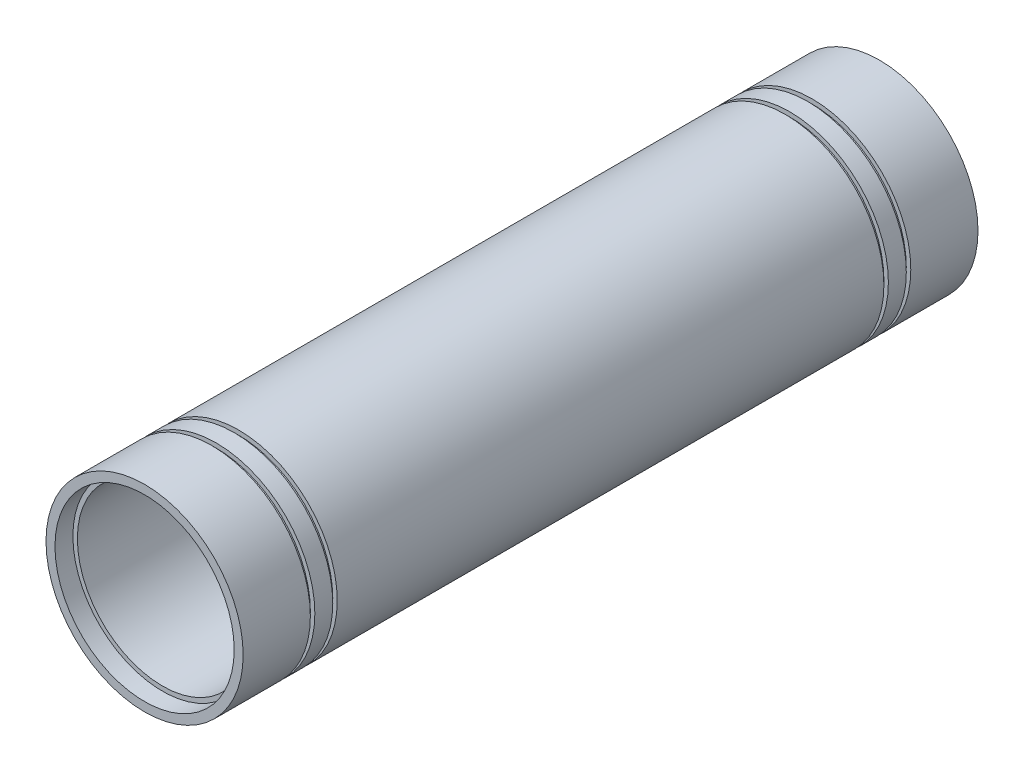
ISO-10303-21;
HEADER;
FILE_DESCRIPTION(('STEP AP214'),'2;1');
FILE_NAME('part.step','',(''),(''),'','','');
FILE_SCHEMA(('AUTOMOTIVE_DESIGN { 1 0 10303 214 1 1 1 1 }'));
ENDSEC;
DATA;
#1=APPLICATION_CONTEXT('core data for automotive mechanical design processes');
#2=APPLICATION_PROTOCOL_DEFINITION('international standard','automotive_design',2000,#1);
#3=PRODUCT_CONTEXT('',#1,'mechanical');
#4=PRODUCT('Part','Part','',(#3));
#5=PRODUCT_RELATED_PRODUCT_CATEGORY('part','',(#4));
#6=PRODUCT_DEFINITION_FORMATION('','',#4);
#7=PRODUCT_DEFINITION_CONTEXT('part definition',#1,'design');
#8=PRODUCT_DEFINITION('design','',#6,#7);
#9=PRODUCT_DEFINITION_SHAPE('','',#8);
#10=(LENGTH_UNIT() NAMED_UNIT(*) SI_UNIT(.MILLI.,.METRE.));
#11=(NAMED_UNIT(*) PLANE_ANGLE_UNIT() SI_UNIT($,.RADIAN.));
#12=(NAMED_UNIT(*) SI_UNIT($,.STERADIAN.) SOLID_ANGLE_UNIT());
#13=UNCERTAINTY_MEASURE_WITH_UNIT(LENGTH_MEASURE(1.E-05),#10,'distance_accuracy_value','');
#14=(GEOMETRIC_REPRESENTATION_CONTEXT(3) GLOBAL_UNCERTAINTY_ASSIGNED_CONTEXT((#13)) GLOBAL_UNIT_ASSIGNED_CONTEXT((#10,
#11,#12)) REPRESENTATION_CONTEXT('',''));
#15=CARTESIAN_POINT('',(0.,0.,0.));
#16=DIRECTION('',(0.,0.,1.));
#17=DIRECTION('',(1.,0.,0.));
#18=AXIS2_PLACEMENT_3D('',#15,#16,#17);
#19=CARTESIAN_POINT('',(0.,0.,82.));
#20=DIRECTION('',(0.,0.,-1.));
#21=DIRECTION('',(-1.,0.,0.));
#22=AXIS2_PLACEMENT_3D('',#19,#20,#21);
#23=CYLINDRICAL_SURFACE('',#22,11.);
#24=CARTESIAN_POINT('',(0.,0.,71.5));
#25=DIRECTION('',(0.,0.,1.));
#26=DIRECTION('',(1.,0.,0.));
#27=AXIS2_PLACEMENT_3D('',#24,#25,#26);
#28=CIRCLE('',#27,11.);
#29=CARTESIAN_POINT('',(11.,0.,71.5));
#30=VERTEX_POINT('',#29);
#31=EDGE_CURVE('E67',#30,#30,#28,.T.);
#32=ORIENTED_EDGE('',*,*,#31,.F.);
#33=EDGE_LOOP('',(#32));
#34=FACE_BOUND('',#33,.T.);
#35=CARTESIAN_POINT('',(0.,0.,10.5));
#36=DIRECTION('',(0.,0.,-1.));
#37=DIRECTION('',(-1.,0.,0.));
#38=AXIS2_PLACEMENT_3D('',#35,#36,#37);
#39=CIRCLE('',#38,11.);
#40=CARTESIAN_POINT('',(-11.,0.,10.5));
#41=VERTEX_POINT('',#40);
#42=EDGE_CURVE('E34',#41,#41,#39,.T.);
#43=ORIENTED_EDGE('',*,*,#42,.F.);
#44=EDGE_LOOP('',(#43));
#45=FACE_BOUND('',#44,.T.);
#46=ADVANCED_FACE('F30',(#34,#45),#23,.T.);
#47=CARTESIAN_POINT('',(0.,0.,9.99999999999999));
#48=DIRECTION('',(0.,0.,-1.));
#49=DIRECTION('',(-1.,0.,0.));
#50=AXIS2_PLACEMENT_3D('',#47,#48,#49);
#51=CIRCLE('',#50,11.);
#52=CARTESIAN_POINT('',(-11.,0.,9.99999999999999));
#53=VERTEX_POINT('',#52);
#54=EDGE_CURVE('E79',#53,#53,#51,.T.);
#55=ORIENTED_EDGE('',*,*,#54,.T.);
#56=EDGE_LOOP('',(#55));
#57=FACE_BOUND('',#56,.T.);
#58=CARTESIAN_POINT('',(0.,0.,7.99999999999999));
#59=DIRECTION('',(0.,0.,-1.));
#60=DIRECTION('',(-1.,0.,0.));
#61=AXIS2_PLACEMENT_3D('',#58,#59,#60);
#62=CIRCLE('',#61,11.);
#63=CARTESIAN_POINT('',(-11.,0.,7.99999999999999));
#64=VERTEX_POINT('',#63);
#65=EDGE_CURVE('E75',#64,#64,#62,.T.);
#66=ORIENTED_EDGE('',*,*,#65,.F.);
#67=EDGE_LOOP('',(#66));
#68=FACE_BOUND('',#67,.T.);
#69=ADVANCED_FACE('F126',(#57,#68),#23,.T.);
#70=CARTESIAN_POINT('',(0.,0.,7.49999999999999));
#71=DIRECTION('',(0.,0.,-1.));
#72=DIRECTION('',(-1.,0.,0.));
#73=AXIS2_PLACEMENT_3D('',#70,#71,#72);
#74=CIRCLE('',#73,11.);
#75=CARTESIAN_POINT('',(-11.,0.,7.49999999999999));
#76=VERTEX_POINT('',#75);
#77=EDGE_CURVE('E72',#76,#76,#74,.T.);
#78=ORIENTED_EDGE('',*,*,#77,.T.);
#79=EDGE_LOOP('',(#78));
#80=FACE_BOUND('',#79,.T.);
#81=CARTESIAN_POINT('',(0.,0.,0.));
#82=DIRECTION('',(0.,0.,1.));
#83=DIRECTION('',(1.,0.,0.));
#84=AXIS2_PLACEMENT_3D('',#81,#82,#83);
#85=CIRCLE('',#84,11.);
#86=CARTESIAN_POINT('',(11.,0.,0.));
#87=VERTEX_POINT('',#86);
#88=EDGE_CURVE('E38',#87,#87,#85,.T.);
#89=ORIENTED_EDGE('',*,*,#88,.T.);
#90=EDGE_LOOP('',(#89));
#91=FACE_BOUND('',#90,.T.);
#92=ADVANCED_FACE('F123',(#80,#91),#23,.T.);
#93=CARTESIAN_POINT('',(0.,0.,72.));
#94=DIRECTION('',(0.,0.,1.));
#95=DIRECTION('',(1.,0.,0.));
#96=AXIS2_PLACEMENT_3D('',#93,#94,#95);
#97=CIRCLE('',#96,11.);
#98=CARTESIAN_POINT('',(11.,0.,72.));
#99=VERTEX_POINT('',#98);
#100=EDGE_CURVE('E64',#99,#99,#97,.T.);
#101=ORIENTED_EDGE('',*,*,#100,.T.);
#102=EDGE_LOOP('',(#101));
#103=FACE_BOUND('',#102,.T.);
#104=CARTESIAN_POINT('',(0.,0.,74.));
#105=DIRECTION('',(0.,0.,1.));
#106=DIRECTION('',(1.,0.,0.));
#107=AXIS2_PLACEMENT_3D('',#104,#105,#106);
#108=CIRCLE('',#107,11.);
#109=CARTESIAN_POINT('',(11.,0.,74.));
#110=VERTEX_POINT('',#109);
#111=EDGE_CURVE('E59',#110,#110,#108,.T.);
#112=ORIENTED_EDGE('',*,*,#111,.F.);
#113=EDGE_LOOP('',(#112));
#114=FACE_BOUND('',#113,.T.);
#115=ADVANCED_FACE('F125',(#103,#114),#23,.T.);
#116=CARTESIAN_POINT('',(0.,0.,82.));
#117=DIRECTION('',(0.,0.,-1.));
#118=DIRECTION('',(-1.,0.,0.));
#119=AXIS2_PLACEMENT_3D('',#116,#117,#118);
#120=CYLINDRICAL_SURFACE('',#119,9.5);
#121=CARTESIAN_POINT('',(0.,0.,2.));
#122=DIRECTION('',(0.,0.,-1.));
#123=DIRECTION('',(-1.,0.,0.));
#124=AXIS2_PLACEMENT_3D('',#121,#122,#123);
#125=CIRCLE('',#124,9.5);
#126=CARTESIAN_POINT('',(-9.5,0.,2.));
#127=VERTEX_POINT('',#126);
#128=EDGE_CURVE('E43',#127,#127,#125,.T.);
#129=ORIENTED_EDGE('',*,*,#128,.T.);
#130=EDGE_LOOP('',(#129));
#131=FACE_BOUND('',#130,.T.);
#132=CARTESIAN_POINT('',(0.,0.,80.));
#133=DIRECTION('',(0.,0.,1.));
#134=DIRECTION('',(1.,0.,0.));
#135=AXIS2_PLACEMENT_3D('',#132,#133,#134);
#136=CIRCLE('',#135,9.5);
#137=CARTESIAN_POINT('',(9.5,0.,80.));
#138=VERTEX_POINT('',#137);
#139=EDGE_CURVE('E52',#138,#138,#136,.T.);
#140=ORIENTED_EDGE('',*,*,#139,.T.);
#141=EDGE_LOOP('',(#140));
#142=FACE_BOUND('',#141,.T.);
#143=ADVANCED_FACE('F132',(#131,#142),#120,.F.);
#144=CARTESIAN_POINT('',(0.,0.,82.));
#145=DIRECTION('',(0.,0.,1.));
#146=DIRECTION('',(1.,0.,0.));
#147=AXIS2_PLACEMENT_3D('',#144,#145,#146);
#148=PLANE('',#147);
#149=CARTESIAN_POINT('',(0.,0.,82.));
#150=DIRECTION('',(0.,0.,1.));
#151=DIRECTION('',(1.,0.,0.));
#152=AXIS2_PLACEMENT_3D('',#149,#150,#151);
#153=CIRCLE('',#152,10.);
#154=CARTESIAN_POINT('',(10.,0.,82.));
#155=VERTEX_POINT('',#154);
#156=EDGE_CURVE('E63',#155,#155,#153,.T.);
#157=ORIENTED_EDGE('',*,*,#156,.F.);
#158=EDGE_LOOP('',(#157));
#159=FACE_BOUND('',#158,.T.);
#160=CARTESIAN_POINT('',(0.,0.,82.));
#161=DIRECTION('',(0.,0.,1.));
#162=DIRECTION('',(1.,0.,0.));
#163=AXIS2_PLACEMENT_3D('',#160,#161,#162);
#164=CIRCLE('',#163,11.);
#165=CARTESIAN_POINT('',(11.,0.,82.));
#166=VERTEX_POINT('',#165);
#167=EDGE_CURVE('E10',#166,#166,#164,.T.);
#168=ORIENTED_EDGE('',*,*,#167,.T.);
#169=EDGE_LOOP('',(#168));
#170=FACE_BOUND('',#169,.T.);
#171=ADVANCED_FACE('F120',(#159,#170),#148,.T.);
#172=CARTESIAN_POINT('',(0.,0.,0.));
#173=DIRECTION('',(0.,0.,1.));
#174=DIRECTION('',(1.,0.,0.));
#175=AXIS2_PLACEMENT_3D('',#172,#173,#174);
#176=PLANE('',#175);
#177=CARTESIAN_POINT('',(0.,0.,0.));
#178=DIRECTION('',(0.,0.,-1.));
#179=DIRECTION('',(-1.,0.,0.));
#180=AXIS2_PLACEMENT_3D('',#177,#178,#179);
#181=CIRCLE('',#180,10.);
#182=CARTESIAN_POINT('',(-10.,0.,0.));
#183=VERTEX_POINT('',#182);
#184=EDGE_CURVE('E46',#183,#183,#181,.T.);
#185=ORIENTED_EDGE('',*,*,#184,.F.);
#186=EDGE_LOOP('',(#185));
#187=FACE_BOUND('',#186,.T.);
#188=ORIENTED_EDGE('',*,*,#88,.F.);
#189=EDGE_LOOP('',(#188));
#190=FACE_BOUND('',#189,.T.);
#191=ADVANCED_FACE('F117',(#187,#190),#176,.F.);
#192=CARTESIAN_POINT('',(0.,0.,74.5));
#193=DIRECTION('',(0.,0.,1.));
#194=DIRECTION('',(1.,0.,0.));
#195=AXIS2_PLACEMENT_3D('',#192,#193,#194);
#196=CIRCLE('',#195,11.);
#197=CARTESIAN_POINT('',(11.,0.,74.5));
#198=VERTEX_POINT('',#197);
#199=EDGE_CURVE('E56',#198,#198,#196,.T.);
#200=ORIENTED_EDGE('',*,*,#199,.T.);
#201=EDGE_LOOP('',(#200));
#202=FACE_BOUND('',#201,.T.);
#203=ORIENTED_EDGE('',*,*,#167,.F.);
#204=EDGE_LOOP('',(#203));
#205=FACE_BOUND('',#204,.T.);
#206=ADVANCED_FACE('F32',(#202,#205),#23,.T.);
#207=CARTESIAN_POINT('',(0.,0.,2.));
#208=DIRECTION('',(0.,0.,-1.));
#209=DIRECTION('',(-1.,0.,0.));
#210=AXIS2_PLACEMENT_3D('',#207,#208,#209);
#211=CYLINDRICAL_SURFACE('',#210,10.);
#212=CARTESIAN_POINT('',(0.,0.,2.));
#213=DIRECTION('',(0.,0.,-1.));
#214=DIRECTION('',(-1.,0.,0.));
#215=AXIS2_PLACEMENT_3D('',#212,#213,#214);
#216=CIRCLE('',#215,10.);
#217=CARTESIAN_POINT('',(-10.,0.,2.));
#218=VERTEX_POINT('',#217);
#219=EDGE_CURVE('E51',#218,#218,#216,.T.);
#220=ORIENTED_EDGE('',*,*,#219,.F.);
#221=EDGE_LOOP('',(#220));
#222=FACE_BOUND('',#221,.T.);
#223=ORIENTED_EDGE('',*,*,#184,.T.);
#224=EDGE_LOOP('',(#223));
#225=FACE_BOUND('',#224,.T.);
#226=ADVANCED_FACE('F115',(#222,#225),#211,.F.);
#227=CARTESIAN_POINT('',(0.,0.,2.));
#228=DIRECTION('',(0.,0.,-1.));
#229=DIRECTION('',(-1.,0.,0.));
#230=AXIS2_PLACEMENT_3D('',#227,#228,#229);
#231=PLANE('',#230);
#232=ORIENTED_EDGE('',*,*,#128,.F.);
#233=EDGE_LOOP('',(#232));
#234=FACE_BOUND('',#233,.T.);
#235=ORIENTED_EDGE('',*,*,#219,.T.);
#236=EDGE_LOOP('',(#235));
#237=FACE_BOUND('',#236,.T.);
#238=ADVANCED_FACE('F145',(#234,#237),#231,.T.);
#239=CARTESIAN_POINT('',(0.,0.,80.));
#240=DIRECTION('',(0.,0.,1.));
#241=DIRECTION('',(1.,0.,0.));
#242=AXIS2_PLACEMENT_3D('',#239,#240,#241);
#243=CYLINDRICAL_SURFACE('',#242,10.);
#244=CARTESIAN_POINT('',(0.,0.,80.));
#245=DIRECTION('',(0.,0.,1.));
#246=DIRECTION('',(1.,0.,0.));
#247=AXIS2_PLACEMENT_3D('',#244,#245,#246);
#248=CIRCLE('',#247,10.);
#249=CARTESIAN_POINT('',(10.,0.,80.));
#250=VERTEX_POINT('',#249);
#251=EDGE_CURVE('E55',#250,#250,#248,.T.);
#252=ORIENTED_EDGE('',*,*,#251,.F.);
#253=EDGE_LOOP('',(#252));
#254=FACE_BOUND('',#253,.T.);
#255=ORIENTED_EDGE('',*,*,#156,.T.);
#256=EDGE_LOOP('',(#255));
#257=FACE_BOUND('',#256,.T.);
#258=ADVANCED_FACE('F170',(#254,#257),#243,.F.);
#259=CARTESIAN_POINT('',(0.,0.,80.));
#260=DIRECTION('',(0.,0.,1.));
#261=DIRECTION('',(1.,0.,0.));
#262=AXIS2_PLACEMENT_3D('',#259,#260,#261);
#263=PLANE('',#262);
#264=ORIENTED_EDGE('',*,*,#139,.F.);
#265=EDGE_LOOP('',(#264));
#266=FACE_BOUND('',#265,.T.);
#267=ORIENTED_EDGE('',*,*,#251,.T.);
#268=EDGE_LOOP('',(#267));
#269=FACE_BOUND('',#268,.T.);
#270=ADVANCED_FACE('F164',(#266,#269),#263,.T.);
#271=CARTESIAN_POINT('',(0.,0.,74.));
#272=DIRECTION('',(0.,0.,1.));
#273=DIRECTION('',(1.,0.,0.));
#274=AXIS2_PLACEMENT_3D('',#271,#272,#273);
#275=PLANE('',#274);
#276=CARTESIAN_POINT('',(0.,0.,74.));
#277=DIRECTION('',(0.,0.,1.));
#278=DIRECTION('',(1.,0.,0.));
#279=AXIS2_PLACEMENT_3D('',#276,#277,#278);
#280=CIRCLE('',#279,10.5);
#281=CARTESIAN_POINT('',(10.5,0.,74.));
#282=VERTEX_POINT('',#281);
#283=EDGE_CURVE('E60',#282,#282,#280,.T.);
#284=ORIENTED_EDGE('',*,*,#283,.F.);
#285=EDGE_LOOP('',(#284));
#286=FACE_BOUND('',#285,.T.);
#287=ORIENTED_EDGE('',*,*,#111,.T.);
#288=EDGE_LOOP('',(#287));
#289=FACE_BOUND('',#288,.T.);
#290=ADVANCED_FACE('F154',(#286,#289),#275,.T.);
#291=CARTESIAN_POINT('',(0.,0.,74.5));
#292=DIRECTION('',(0.,0.,1.));
#293=DIRECTION('',(1.,0.,0.));
#294=AXIS2_PLACEMENT_3D('',#291,#292,#293);
#295=PLANE('',#294);
#296=CARTESIAN_POINT('',(0.,0.,74.5));
#297=DIRECTION('',(0.,0.,1.));
#298=DIRECTION('',(1.,0.,0.));
#299=AXIS2_PLACEMENT_3D('',#296,#297,#298);
#300=CIRCLE('',#299,10.5);
#301=CARTESIAN_POINT('',(10.5,0.,74.5));
#302=VERTEX_POINT('',#301);
#303=EDGE_CURVE('E71',#302,#302,#300,.T.);
#304=ORIENTED_EDGE('',*,*,#303,.T.);
#305=EDGE_LOOP('',(#304));
#306=FACE_BOUND('',#305,.T.);
#307=ORIENTED_EDGE('',*,*,#199,.F.);
#308=EDGE_LOOP('',(#307));
#309=FACE_BOUND('',#308,.T.);
#310=ADVANCED_FACE('F151',(#306,#309),#295,.F.);
#311=CARTESIAN_POINT('',(0.,0.,74.));
#312=DIRECTION('',(0.,0.,1.));
#313=DIRECTION('',(1.,0.,0.));
#314=AXIS2_PLACEMENT_3D('',#311,#312,#313);
#315=CYLINDRICAL_SURFACE('',#314,10.5);
#316=ORIENTED_EDGE('',*,*,#283,.T.);
#317=EDGE_LOOP('',(#316));
#318=FACE_BOUND('',#317,.T.);
#319=ORIENTED_EDGE('',*,*,#303,.F.);
#320=EDGE_LOOP('',(#319));
#321=FACE_BOUND('',#320,.T.);
#322=ADVANCED_FACE('F153',(#318,#321),#315,.T.);
#323=CARTESIAN_POINT('',(0.,0.,71.5));
#324=DIRECTION('',(0.,0.,1.));
#325=DIRECTION('',(1.,0.,0.));
#326=AXIS2_PLACEMENT_3D('',#323,#324,#325);
#327=PLANE('',#326);
#328=CARTESIAN_POINT('',(0.,0.,71.5));
#329=DIRECTION('',(0.,0.,1.));
#330=DIRECTION('',(1.,0.,0.));
#331=AXIS2_PLACEMENT_3D('',#328,#329,#330);
#332=CIRCLE('',#331,10.5);
#333=CARTESIAN_POINT('',(10.5,0.,71.5));
#334=VERTEX_POINT('',#333);
#335=EDGE_CURVE('E68',#334,#334,#332,.T.);
#336=ORIENTED_EDGE('',*,*,#335,.F.);
#337=EDGE_LOOP('',(#336));
#338=FACE_BOUND('',#337,.T.);
#339=ORIENTED_EDGE('',*,*,#31,.T.);
#340=EDGE_LOOP('',(#339));
#341=FACE_BOUND('',#340,.T.);
#342=ADVANCED_FACE('F161',(#338,#341),#327,.T.);
#343=CARTESIAN_POINT('',(0.,0.,72.));
#344=DIRECTION('',(0.,0.,1.));
#345=DIRECTION('',(1.,0.,0.));
#346=AXIS2_PLACEMENT_3D('',#343,#344,#345);
#347=PLANE('',#346);
#348=CARTESIAN_POINT('',(0.,0.,72.));
#349=DIRECTION('',(0.,0.,1.));
#350=DIRECTION('',(1.,0.,0.));
#351=AXIS2_PLACEMENT_3D('',#348,#349,#350);
#352=CIRCLE('',#351,10.5);
#353=CARTESIAN_POINT('',(10.5,0.,72.));
#354=VERTEX_POINT('',#353);
#355=EDGE_CURVE('E78',#354,#354,#352,.T.);
#356=ORIENTED_EDGE('',*,*,#355,.T.);
#357=EDGE_LOOP('',(#356));
#358=FACE_BOUND('',#357,.T.);
#359=ORIENTED_EDGE('',*,*,#100,.F.);
#360=EDGE_LOOP('',(#359));
#361=FACE_BOUND('',#360,.T.);
#362=ADVANCED_FACE('F255',(#358,#361),#347,.F.);
#363=CARTESIAN_POINT('',(0.,0.,71.5));
#364=DIRECTION('',(0.,0.,1.));
#365=DIRECTION('',(1.,0.,0.));
#366=AXIS2_PLACEMENT_3D('',#363,#364,#365);
#367=CYLINDRICAL_SURFACE('',#366,10.5);
#368=ORIENTED_EDGE('',*,*,#335,.T.);
#369=EDGE_LOOP('',(#368));
#370=FACE_BOUND('',#369,.T.);
#371=ORIENTED_EDGE('',*,*,#355,.F.);
#372=EDGE_LOOP('',(#371));
#373=FACE_BOUND('',#372,.T.);
#374=ADVANCED_FACE('F264',(#370,#373),#367,.T.);
#375=CARTESIAN_POINT('',(0.,0.,7.99999999999999));
#376=DIRECTION('',(0.,0.,-1.));
#377=DIRECTION('',(1.,0.,0.));
#378=AXIS2_PLACEMENT_3D('',#375,#376,#377);
#379=PLANE('',#378);
#380=CARTESIAN_POINT('',(0.,0.,7.99999999999999));
#381=DIRECTION('',(0.,0.,1.));
#382=DIRECTION('',(1.,0.,0.));
#383=AXIS2_PLACEMENT_3D('',#380,#381,#382);
#384=CIRCLE('',#383,10.5);
#385=CARTESIAN_POINT('',(10.5,0.,7.99999999999999));
#386=VERTEX_POINT('',#385);
#387=EDGE_CURVE('E76',#386,#386,#384,.T.);
#388=ORIENTED_EDGE('',*,*,#387,.T.);
#389=EDGE_LOOP('',(#388));
#390=FACE_BOUND('',#389,.T.);
#391=ORIENTED_EDGE('',*,*,#65,.T.);
#392=EDGE_LOOP('',(#391));
#393=FACE_BOUND('',#392,.T.);
#394=ADVANCED_FACE('F273',(#390,#393),#379,.T.);
#395=CARTESIAN_POINT('',(0.,0.,7.49999999999999));
#396=DIRECTION('',(0.,0.,-1.));
#397=DIRECTION('',(1.,0.,0.));
#398=AXIS2_PLACEMENT_3D('',#395,#396,#397);
#399=PLANE('',#398);
#400=CARTESIAN_POINT('',(0.,0.,7.49999999999999));
#401=DIRECTION('',(0.,0.,1.));
#402=DIRECTION('',(1.,0.,0.));
#403=AXIS2_PLACEMENT_3D('',#400,#401,#402);
#404=CIRCLE('',#403,10.5);
#405=CARTESIAN_POINT('',(10.5,0.,7.49999999999999));
#406=VERTEX_POINT('',#405);
#407=EDGE_CURVE('E85',#406,#406,#404,.T.);
#408=ORIENTED_EDGE('',*,*,#407,.F.);
#409=EDGE_LOOP('',(#408));
#410=FACE_BOUND('',#409,.T.);
#411=ORIENTED_EDGE('',*,*,#77,.F.);
#412=EDGE_LOOP('',(#411));
#413=FACE_BOUND('',#412,.T.);
#414=ADVANCED_FACE('F285',(#410,#413),#399,.F.);
#415=CARTESIAN_POINT('',(0.,0.,7.99999999999999));
#416=DIRECTION('',(0.,0.,-1.));
#417=DIRECTION('',(-1.,0.,0.));
#418=AXIS2_PLACEMENT_3D('',#415,#416,#417);
#419=CYLINDRICAL_SURFACE('',#418,10.5);
#420=ORIENTED_EDGE('',*,*,#387,.F.);
#421=EDGE_LOOP('',(#420));
#422=FACE_BOUND('',#421,.T.);
#423=ORIENTED_EDGE('',*,*,#407,.T.);
#424=EDGE_LOOP('',(#423));
#425=FACE_BOUND('',#424,.T.);
#426=ADVANCED_FACE('F294',(#422,#425),#419,.T.);
#427=CARTESIAN_POINT('',(0.,0.,10.5));
#428=DIRECTION('',(0.,0.,-1.));
#429=DIRECTION('',(1.,0.,0.));
#430=AXIS2_PLACEMENT_3D('',#427,#428,#429);
#431=PLANE('',#430);
#432=CARTESIAN_POINT('',(0.,0.,10.5));
#433=DIRECTION('',(0.,0.,1.));
#434=DIRECTION('',(1.,0.,0.));
#435=AXIS2_PLACEMENT_3D('',#432,#433,#434);
#436=CIRCLE('',#435,10.5);
#437=CARTESIAN_POINT('',(10.5,0.,10.5));
#438=VERTEX_POINT('',#437);
#439=EDGE_CURVE('E81',#438,#438,#436,.T.);
#440=ORIENTED_EDGE('',*,*,#439,.T.);
#441=EDGE_LOOP('',(#440));
#442=FACE_BOUND('',#441,.T.);
#443=ORIENTED_EDGE('',*,*,#42,.T.);
#444=EDGE_LOOP('',(#443));
#445=FACE_BOUND('',#444,.T.);
#446=ADVANCED_FACE('F303',(#442,#445),#431,.T.);
#447=CARTESIAN_POINT('',(0.,0.,9.99999999999999));
#448=DIRECTION('',(0.,0.,-1.));
#449=DIRECTION('',(1.,0.,0.));
#450=AXIS2_PLACEMENT_3D('',#447,#448,#449);
#451=PLANE('',#450);
#452=CARTESIAN_POINT('',(0.,0.,9.99999999999999));
#453=DIRECTION('',(0.,0.,1.));
#454=DIRECTION('',(1.,0.,0.));
#455=AXIS2_PLACEMENT_3D('',#452,#453,#454);
#456=CIRCLE('',#455,10.5);
#457=CARTESIAN_POINT('',(10.5,0.,9.99999999999999));
#458=VERTEX_POINT('',#457);
#459=EDGE_CURVE('E87',#458,#458,#456,.T.);
#460=ORIENTED_EDGE('',*,*,#459,.F.);
#461=EDGE_LOOP('',(#460));
#462=FACE_BOUND('',#461,.T.);
#463=ORIENTED_EDGE('',*,*,#54,.F.);
#464=EDGE_LOOP('',(#463));
#465=FACE_BOUND('',#464,.T.);
#466=ADVANCED_FACE('F316',(#462,#465),#451,.F.);
#467=CARTESIAN_POINT('',(0.,0.,10.5));
#468=DIRECTION('',(0.,0.,-1.));
#469=DIRECTION('',(-1.,0.,0.));
#470=AXIS2_PLACEMENT_3D('',#467,#468,#469);
#471=CYLINDRICAL_SURFACE('',#470,10.5);
#472=ORIENTED_EDGE('',*,*,#439,.F.);
#473=EDGE_LOOP('',(#472));
#474=FACE_BOUND('',#473,.T.);
#475=ORIENTED_EDGE('',*,*,#459,.T.);
#476=EDGE_LOOP('',(#475));
#477=FACE_BOUND('',#476,.T.);
#478=ADVANCED_FACE('F324',(#474,#477),#471,.T.);
#479=CLOSED_SHELL('',(#46,#69,#92,#115,#143,#171,#191,#206,#226,#238,#258,#270,#290,#310,#322,
#342,#362,#374,#394,#414,#426,#446,#466,#478));
#480=MANIFOLD_SOLID_BREP('B2',#479);
#481=ADVANCED_BREP_SHAPE_REPRESENTATION('',(#18,#480),#14);
#482=SHAPE_DEFINITION_REPRESENTATION(#9,#481);
ENDSEC;
END-ISO-10303-21;
